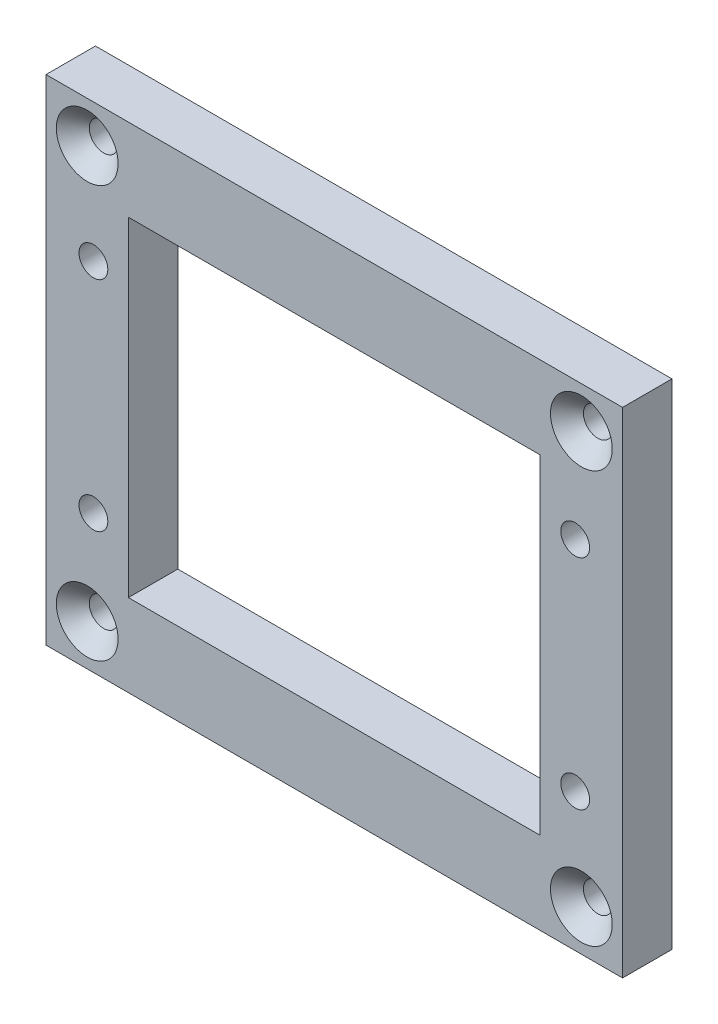
ISO-10303-21;
HEADER;
FILE_DESCRIPTION(('STEP AP214'),'2;1');
FILE_NAME('part.step','',(''),(''),'','','');
FILE_SCHEMA(('AUTOMOTIVE_DESIGN { 1 0 10303 214 1 1 1 1 }'));
ENDSEC;
DATA;
#1=APPLICATION_CONTEXT('core data for automotive mechanical design processes');
#2=APPLICATION_PROTOCOL_DEFINITION('international standard','automotive_design',2000,#1);
#3=PRODUCT_CONTEXT('',#1,'mechanical');
#4=PRODUCT('Part','Part','',(#3));
#5=PRODUCT_RELATED_PRODUCT_CATEGORY('part','',(#4));
#6=PRODUCT_DEFINITION_FORMATION('','',#4);
#7=PRODUCT_DEFINITION_CONTEXT('part definition',#1,'design');
#8=PRODUCT_DEFINITION('design','',#6,#7);
#9=PRODUCT_DEFINITION_SHAPE('','',#8);
#10=(LENGTH_UNIT() NAMED_UNIT(*) SI_UNIT(.MILLI.,.METRE.));
#11=(NAMED_UNIT(*) PLANE_ANGLE_UNIT() SI_UNIT($,.RADIAN.));
#12=(NAMED_UNIT(*) SI_UNIT($,.STERADIAN.) SOLID_ANGLE_UNIT());
#13=UNCERTAINTY_MEASURE_WITH_UNIT(LENGTH_MEASURE(1.E-05),#10,'distance_accuracy_value','');
#14=(GEOMETRIC_REPRESENTATION_CONTEXT(3) GLOBAL_UNCERTAINTY_ASSIGNED_CONTEXT((#13)) GLOBAL_UNIT_ASSIGNED_CONTEXT((#10,
#11,#12)) REPRESENTATION_CONTEXT('',''));
#15=CARTESIAN_POINT('',(0.,0.,0.));
#16=DIRECTION('',(0.,0.,1.));
#17=DIRECTION('',(1.,0.,0.));
#18=AXIS2_PLACEMENT_3D('',#15,#16,#17);
#19=CARTESIAN_POINT('',(5.75,16.75,6.));
#20=DIRECTION('',(0.,0.,-1.));
#21=DIRECTION('',(-1.,0.,0.));
#22=AXIS2_PLACEMENT_3D('',#19,#20,#21);
#23=CYLINDRICAL_SURFACE('',#22,1.75);
#24=CARTESIAN_POINT('',(5.75,16.75,6.));
#25=DIRECTION('',(0.,0.,1.));
#26=DIRECTION('',(1.,0.,0.));
#27=AXIS2_PLACEMENT_3D('',#24,#25,#26);
#28=CIRCLE('',#27,1.75);
#29=CARTESIAN_POINT('',(7.5,16.75,6.));
#30=VERTEX_POINT('',#29);
#31=EDGE_CURVE('E150',#30,#30,#28,.T.);
#32=ORIENTED_EDGE('',*,*,#31,.T.);
#33=EDGE_LOOP('',(#32));
#34=FACE_BOUND('',#33,.T.);
#35=CARTESIAN_POINT('',(5.75,16.75,3.));
#36=DIRECTION('',(0.,0.,-1.));
#37=DIRECTION('',(-1.,0.,0.));
#38=AXIS2_PLACEMENT_3D('',#35,#36,#37);
#39=CIRCLE('',#38,1.75);
#40=CARTESIAN_POINT('',(4.,16.75,3.));
#41=VERTEX_POINT('',#40);
#42=EDGE_CURVE('E37',#41,#41,#39,.T.);
#43=ORIENTED_EDGE('',*,*,#42,.T.);
#44=EDGE_LOOP('',(#43));
#45=FACE_BOUND('',#44,.T.);
#46=ADVANCED_FACE('F33',(#34,#45),#23,.F.);
#47=CARTESIAN_POINT('',(5.75,43.25,6.));
#48=DIRECTION('',(0.,0.,-1.));
#49=DIRECTION('',(-1.,0.,0.));
#50=AXIS2_PLACEMENT_3D('',#47,#48,#49);
#51=CYLINDRICAL_SURFACE('',#50,1.75);
#52=CARTESIAN_POINT('',(5.75,43.25,6.));
#53=DIRECTION('',(0.,0.,1.));
#54=DIRECTION('',(1.,0.,0.));
#55=AXIS2_PLACEMENT_3D('',#52,#53,#54);
#56=CIRCLE('',#55,1.75);
#57=CARTESIAN_POINT('',(7.5,43.25,6.));
#58=VERTEX_POINT('',#57);
#59=EDGE_CURVE('E147',#58,#58,#56,.T.);
#60=ORIENTED_EDGE('',*,*,#59,.T.);
#61=EDGE_LOOP('',(#60));
#62=FACE_BOUND('',#61,.T.);
#63=CARTESIAN_POINT('',(5.75,43.25,3.));
#64=DIRECTION('',(0.,0.,-1.));
#65=DIRECTION('',(-1.,0.,0.));
#66=AXIS2_PLACEMENT_3D('',#63,#64,#65);
#67=CIRCLE('',#66,1.75);
#68=CARTESIAN_POINT('',(4.,43.25,3.));
#69=VERTEX_POINT('',#68);
#70=EDGE_CURVE('E210',#69,#69,#67,.T.);
#71=ORIENTED_EDGE('',*,*,#70,.T.);
#72=EDGE_LOOP('',(#71));
#73=FACE_BOUND('',#72,.T.);
#74=ADVANCED_FACE('F253',(#62,#73),#51,.F.);
#75=CARTESIAN_POINT('',(64.25,16.75,6.));
#76=DIRECTION('',(0.,0.,-1.));
#77=DIRECTION('',(-1.,0.,0.));
#78=AXIS2_PLACEMENT_3D('',#75,#76,#77);
#79=CYLINDRICAL_SURFACE('',#78,1.75);
#80=CARTESIAN_POINT('',(64.25,16.75,6.));
#81=DIRECTION('',(0.,0.,1.));
#82=DIRECTION('',(1.,0.,0.));
#83=AXIS2_PLACEMENT_3D('',#80,#81,#82);
#84=CIRCLE('',#83,1.75);
#85=CARTESIAN_POINT('',(66.,16.75,6.));
#86=VERTEX_POINT('',#85);
#87=EDGE_CURVE('E141',#86,#86,#84,.T.);
#88=ORIENTED_EDGE('',*,*,#87,.T.);
#89=EDGE_LOOP('',(#88));
#90=FACE_BOUND('',#89,.T.);
#91=CARTESIAN_POINT('',(64.25,16.75,3.));
#92=DIRECTION('',(0.,0.,-1.));
#93=DIRECTION('',(-1.,0.,0.));
#94=AXIS2_PLACEMENT_3D('',#91,#92,#93);
#95=CIRCLE('',#94,1.75);
#96=CARTESIAN_POINT('',(62.5,16.75,3.));
#97=VERTEX_POINT('',#96);
#98=EDGE_CURVE('E208',#97,#97,#95,.T.);
#99=ORIENTED_EDGE('',*,*,#98,.T.);
#100=EDGE_LOOP('',(#99));
#101=FACE_BOUND('',#100,.T.);
#102=ADVANCED_FACE('F259',(#90,#101),#79,.F.);
#103=CARTESIAN_POINT('',(64.25,43.25,6.));
#104=DIRECTION('',(0.,0.,-1.));
#105=DIRECTION('',(-1.,0.,0.));
#106=AXIS2_PLACEMENT_3D('',#103,#104,#105);
#107=CYLINDRICAL_SURFACE('',#106,1.75);
#108=CARTESIAN_POINT('',(64.25,43.25,6.));
#109=DIRECTION('',(0.,0.,1.));
#110=DIRECTION('',(1.,0.,0.));
#111=AXIS2_PLACEMENT_3D('',#108,#109,#110);
#112=CIRCLE('',#111,1.75);
#113=CARTESIAN_POINT('',(66.,43.25,6.));
#114=VERTEX_POINT('',#113);
#115=EDGE_CURVE('E144',#114,#114,#112,.T.);
#116=ORIENTED_EDGE('',*,*,#115,.T.);
#117=EDGE_LOOP('',(#116));
#118=FACE_BOUND('',#117,.T.);
#119=CARTESIAN_POINT('',(64.25,43.25,3.));
#120=DIRECTION('',(0.,0.,-1.));
#121=DIRECTION('',(-1.,0.,0.));
#122=AXIS2_PLACEMENT_3D('',#119,#120,#121);
#123=CIRCLE('',#122,1.75);
#124=CARTESIAN_POINT('',(62.5,43.25,3.));
#125=VERTEX_POINT('',#124);
#126=EDGE_CURVE('E203',#125,#125,#123,.T.);
#127=ORIENTED_EDGE('',*,*,#126,.T.);
#128=EDGE_LOOP('',(#127));
#129=FACE_BOUND('',#128,.T.);
#130=ADVANCED_FACE('F266',(#118,#129),#107,.F.);
#131=CARTESIAN_POINT('',(0.,0.,6.));
#132=DIRECTION('',(0.,0.,-1.));
#133=DIRECTION('',(-1.,0.,0.));
#134=AXIS2_PLACEMENT_3D('',#131,#132,#133);
#135=PLANE('',#134);
#136=CARTESIAN_POINT('',(5.00000000000123,5.,6.));
#137=DIRECTION('',(0.,0.,-1.));
#138=DIRECTION('',(-1.,0.,0.));
#139=AXIS2_PLACEMENT_3D('',#136,#137,#138);
#140=CIRCLE('',#139,3.75000000000002);
#141=CARTESIAN_POINT('',(1.25000000000122,5.,6.));
#142=VERTEX_POINT('',#141);
#143=EDGE_CURVE('E195',#142,#142,#140,.T.);
#144=ORIENTED_EDGE('',*,*,#143,.T.);
#145=EDGE_LOOP('',(#144));
#146=FACE_BOUND('',#145,.T.);
#147=CARTESIAN_POINT('',(65.0000000000012,5.,6.));
#148=DIRECTION('',(0.,0.,-1.));
#149=DIRECTION('',(-1.,0.,0.));
#150=AXIS2_PLACEMENT_3D('',#147,#148,#149);
#151=CIRCLE('',#150,3.75000000000002);
#152=CARTESIAN_POINT('',(61.2500000000012,5.,6.));
#153=VERTEX_POINT('',#152);
#154=EDGE_CURVE('E192',#153,#153,#151,.T.);
#155=ORIENTED_EDGE('',*,*,#154,.T.);
#156=EDGE_LOOP('',(#155));
#157=FACE_BOUND('',#156,.T.);
#158=CARTESIAN_POINT('',(65.,55.,6.));
#159=DIRECTION('',(0.,0.,-1.));
#160=DIRECTION('',(-1.,0.,0.));
#161=AXIS2_PLACEMENT_3D('',#158,#159,#160);
#162=CIRCLE('',#161,3.75000000000002);
#163=CARTESIAN_POINT('',(61.25,55.,6.));
#164=VERTEX_POINT('',#163);
#165=EDGE_CURVE('E189',#164,#164,#162,.T.);
#166=ORIENTED_EDGE('',*,*,#165,.T.);
#167=EDGE_LOOP('',(#166));
#168=FACE_BOUND('',#167,.T.);
#169=CARTESIAN_POINT('',(5.,55.,6.));
#170=DIRECTION('',(0.,0.,-1.));
#171=DIRECTION('',(-1.,0.,0.));
#172=AXIS2_PLACEMENT_3D('',#169,#170,#171);
#173=CIRCLE('',#172,3.75000000000002);
#174=CARTESIAN_POINT('',(1.24999999999998,55.,6.));
#175=VERTEX_POINT('',#174);
#176=EDGE_CURVE('E186',#175,#175,#173,.T.);
#177=ORIENTED_EDGE('',*,*,#176,.T.);
#178=EDGE_LOOP('',(#177));
#179=FACE_BOUND('',#178,.T.);
#180=ORIENTED_EDGE('',*,*,#87,.F.);
#181=EDGE_LOOP('',(#180));
#182=FACE_BOUND('',#181,.T.);
#183=ORIENTED_EDGE('',*,*,#115,.F.);
#184=EDGE_LOOP('',(#183));
#185=FACE_BOUND('',#184,.T.);
#186=ORIENTED_EDGE('',*,*,#59,.F.);
#187=EDGE_LOOP('',(#186));
#188=FACE_BOUND('',#187,.T.);
#189=ORIENTED_EDGE('',*,*,#31,.F.);
#190=EDGE_LOOP('',(#189));
#191=FACE_BOUND('',#190,.T.);
#192=DIRECTION('',(0.,-1.,0.));
#193=VECTOR('',#192,1.);
#194=CARTESIAN_POINT('',(0.,0.,6.));
#195=LINE('',#194,#193);
#196=CARTESIAN_POINT('',(0.,60.,6.));
#197=VERTEX_POINT('',#196);
#198=CARTESIAN_POINT('',(0.,0.,6.));
#199=VERTEX_POINT('',#198);
#200=EDGE_CURVE('E154',#197,#199,#195,.T.);
#201=ORIENTED_EDGE('',*,*,#200,.T.);
#202=DIRECTION('',(1.,0.,0.));
#203=VECTOR('',#202,1.);
#204=CARTESIAN_POINT('',(0.,0.,6.));
#205=LINE('',#204,#203);
#206=CARTESIAN_POINT('',(70.,0.,6.));
#207=VERTEX_POINT('',#206);
#208=EDGE_CURVE('E157',#199,#207,#205,.T.);
#209=ORIENTED_EDGE('',*,*,#208,.T.);
#210=DIRECTION('',(0.,1.,0.));
#211=VECTOR('',#210,1.);
#212=CARTESIAN_POINT('',(70.,0.,6.));
#213=LINE('',#212,#211);
#214=CARTESIAN_POINT('',(70.,60.,6.));
#215=VERTEX_POINT('',#214);
#216=EDGE_CURVE('E160',#207,#215,#213,.T.);
#217=ORIENTED_EDGE('',*,*,#216,.T.);
#218=DIRECTION('',(-1.,0.,0.));
#219=VECTOR('',#218,1.);
#220=CARTESIAN_POINT('',(0.,60.,6.));
#221=LINE('',#220,#219);
#222=EDGE_CURVE('E162',#215,#197,#221,.T.);
#223=ORIENTED_EDGE('',*,*,#222,.T.);
#224=EDGE_LOOP('',(#201,#209,#217,#223));
#225=FACE_BOUND('',#224,.T.);
#226=DIRECTION('',(0.,-1.,0.));
#227=VECTOR('',#226,1.);
#228=CARTESIAN_POINT('',(10.,50.,6.));
#229=LINE('',#228,#227);
#230=CARTESIAN_POINT('',(10.,50.,6.));
#231=VERTEX_POINT('',#230);
#232=CARTESIAN_POINT('',(10.,10.,6.));
#233=VERTEX_POINT('',#232);
#234=EDGE_CURVE('E100',#231,#233,#229,.T.);
#235=ORIENTED_EDGE('',*,*,#234,.F.);
#236=DIRECTION('',(-1.,0.,0.));
#237=VECTOR('',#236,1.);
#238=CARTESIAN_POINT('',(10.,50.,6.));
#239=LINE('',#238,#237);
#240=CARTESIAN_POINT('',(60.,50.,6.));
#241=VERTEX_POINT('',#240);
#242=EDGE_CURVE('E123',#241,#231,#239,.T.);
#243=ORIENTED_EDGE('',*,*,#242,.F.);
#244=DIRECTION('',(0.,1.,0.));
#245=VECTOR('',#244,1.);
#246=CARTESIAN_POINT('',(60.,50.,6.));
#247=LINE('',#246,#245);
#248=CARTESIAN_POINT('',(60.,10.,6.));
#249=VERTEX_POINT('',#248);
#250=EDGE_CURVE('E121',#249,#241,#247,.T.);
#251=ORIENTED_EDGE('',*,*,#250,.F.);
#252=DIRECTION('',(1.,0.,0.));
#253=VECTOR('',#252,1.);
#254=CARTESIAN_POINT('',(10.,10.,6.));
#255=LINE('',#254,#253);
#256=EDGE_CURVE('E108',#233,#249,#255,.T.);
#257=ORIENTED_EDGE('',*,*,#256,.F.);
#258=EDGE_LOOP('',(#235,#243,#251,#257));
#259=FACE_BOUND('',#258,.T.);
#260=ADVANCED_FACE('F120',(#146,#157,#168,#179,#182,#185,#188,#191,#225,#259),#135,.F.);
#261=CARTESIAN_POINT('',(0.,0.,0.));
#262=DIRECTION('',(0.,0.,-1.));
#263=DIRECTION('',(-1.,0.,0.));
#264=AXIS2_PLACEMENT_3D('',#261,#262,#263);
#265=PLANE('',#264);
#266=CARTESIAN_POINT('',(64.25,16.75,0.));
#267=DIRECTION('',(0.,0.,-1.));
#268=DIRECTION('',(-1.,0.,0.));
#269=AXIS2_PLACEMENT_3D('',#266,#267,#268);
#270=CIRCLE('',#269,3.);
#271=CARTESIAN_POINT('',(61.25,16.75,0.));
#272=VERTEX_POINT('',#271);
#273=EDGE_CURVE('E484',#272,#272,#270,.T.);
#274=ORIENTED_EDGE('',*,*,#273,.F.);
#275=EDGE_LOOP('',(#274));
#276=FACE_BOUND('',#275,.T.);
#277=CARTESIAN_POINT('',(5.75,16.75,0.));
#278=DIRECTION('',(0.,0.,-1.));
#279=DIRECTION('',(-1.,0.,0.));
#280=AXIS2_PLACEMENT_3D('',#277,#278,#279);
#281=CIRCLE('',#280,3.);
#282=CARTESIAN_POINT('',(2.75,16.75,0.));
#283=VERTEX_POINT('',#282);
#284=EDGE_CURVE('E485',#283,#283,#281,.T.);
#285=ORIENTED_EDGE('',*,*,#284,.F.);
#286=EDGE_LOOP('',(#285));
#287=FACE_BOUND('',#286,.T.);
#288=CARTESIAN_POINT('',(5.75,43.25,0.));
#289=DIRECTION('',(0.,0.,-1.));
#290=DIRECTION('',(-1.,0.,0.));
#291=AXIS2_PLACEMENT_3D('',#288,#289,#290);
#292=CIRCLE('',#291,3.);
#293=CARTESIAN_POINT('',(2.75,43.25,0.));
#294=VERTEX_POINT('',#293);
#295=EDGE_CURVE('E495',#294,#294,#292,.T.);
#296=ORIENTED_EDGE('',*,*,#295,.F.);
#297=EDGE_LOOP('',(#296));
#298=FACE_BOUND('',#297,.T.);
#299=CARTESIAN_POINT('',(64.25,43.25,0.));
#300=DIRECTION('',(0.,0.,-1.));
#301=DIRECTION('',(-1.,0.,0.));
#302=AXIS2_PLACEMENT_3D('',#299,#300,#301);
#303=CIRCLE('',#302,3.);
#304=CARTESIAN_POINT('',(61.25,43.25,0.));
#305=VERTEX_POINT('',#304);
#306=EDGE_CURVE('E216',#305,#305,#303,.T.);
#307=ORIENTED_EDGE('',*,*,#306,.F.);
#308=EDGE_LOOP('',(#307));
#309=FACE_BOUND('',#308,.T.);
#310=CARTESIAN_POINT('',(65.0000000000012,5.,0.));
#311=DIRECTION('',(0.,0.,1.));
#312=DIRECTION('',(1.,0.,0.));
#313=AXIS2_PLACEMENT_3D('',#310,#311,#312);
#314=CIRCLE('',#313,1.75);
#315=CARTESIAN_POINT('',(66.7500000000012,5.,0.));
#316=VERTEX_POINT('',#315);
#317=EDGE_CURVE('E229',#316,#316,#314,.T.);
#318=ORIENTED_EDGE('',*,*,#317,.T.);
#319=EDGE_LOOP('',(#318));
#320=FACE_BOUND('',#319,.T.);
#321=DIRECTION('',(-1.,0.,0.));
#322=VECTOR('',#321,1.);
#323=CARTESIAN_POINT('',(10.,50.,0.));
#324=LINE('',#323,#322);
#325=CARTESIAN_POINT('',(60.,50.,0.));
#326=VERTEX_POINT('',#325);
#327=CARTESIAN_POINT('',(10.,50.,0.));
#328=VERTEX_POINT('',#327);
#329=EDGE_CURVE('E109',#326,#328,#324,.T.);
#330=ORIENTED_EDGE('',*,*,#329,.T.);
#331=DIRECTION('',(0.,-1.,0.));
#332=VECTOR('',#331,1.);
#333=CARTESIAN_POINT('',(10.,50.,0.));
#334=LINE('',#333,#332);
#335=CARTESIAN_POINT('',(10.,10.,0.));
#336=VERTEX_POINT('',#335);
#337=EDGE_CURVE('E58',#328,#336,#334,.T.);
#338=ORIENTED_EDGE('',*,*,#337,.T.);
#339=DIRECTION('',(1.,0.,0.));
#340=VECTOR('',#339,1.);
#341=CARTESIAN_POINT('',(10.,10.,0.));
#342=LINE('',#341,#340);
#343=CARTESIAN_POINT('',(60.,10.,0.));
#344=VERTEX_POINT('',#343);
#345=EDGE_CURVE('E115',#336,#344,#342,.T.);
#346=ORIENTED_EDGE('',*,*,#345,.T.);
#347=DIRECTION('',(0.,1.,0.));
#348=VECTOR('',#347,1.);
#349=CARTESIAN_POINT('',(60.,50.,0.));
#350=LINE('',#349,#348);
#351=EDGE_CURVE('E131',#344,#326,#350,.T.);
#352=ORIENTED_EDGE('',*,*,#351,.T.);
#353=EDGE_LOOP('',(#330,#338,#346,#352));
#354=FACE_BOUND('',#353,.T.);
#355=CARTESIAN_POINT('',(5.,55.,0.));
#356=DIRECTION('',(0.,0.,1.));
#357=DIRECTION('',(1.,0.,0.));
#358=AXIS2_PLACEMENT_3D('',#355,#356,#357);
#359=CIRCLE('',#358,1.75);
#360=CARTESIAN_POINT('',(6.75,55.,0.));
#361=VERTEX_POINT('',#360);
#362=EDGE_CURVE('E116',#361,#361,#359,.T.);
#363=ORIENTED_EDGE('',*,*,#362,.T.);
#364=EDGE_LOOP('',(#363));
#365=FACE_BOUND('',#364,.T.);
#366=DIRECTION('',(0.,-1.,0.));
#367=VECTOR('',#366,1.);
#368=CARTESIAN_POINT('',(0.,0.,0.));
#369=LINE('',#368,#367);
#370=CARTESIAN_POINT('',(0.,60.,0.));
#371=VERTEX_POINT('',#370);
#372=CARTESIAN_POINT('',(0.,0.,0.));
#373=VERTEX_POINT('',#372);
#374=EDGE_CURVE('E153',#371,#373,#369,.T.);
#375=ORIENTED_EDGE('',*,*,#374,.F.);
#376=DIRECTION('',(-1.,0.,0.));
#377=VECTOR('',#376,1.);
#378=CARTESIAN_POINT('',(0.,60.,0.));
#379=LINE('',#378,#377);
#380=CARTESIAN_POINT('',(70.,60.,0.));
#381=VERTEX_POINT('',#380);
#382=EDGE_CURVE('E158',#381,#371,#379,.T.);
#383=ORIENTED_EDGE('',*,*,#382,.F.);
#384=DIRECTION('',(0.,1.,0.));
#385=VECTOR('',#384,1.);
#386=CARTESIAN_POINT('',(70.,0.,0.));
#387=LINE('',#386,#385);
#388=CARTESIAN_POINT('',(70.,0.,0.));
#389=VERTEX_POINT('',#388);
#390=EDGE_CURVE('E169',#389,#381,#387,.T.);
#391=ORIENTED_EDGE('',*,*,#390,.F.);
#392=DIRECTION('',(1.,0.,0.));
#393=VECTOR('',#392,1.);
#394=CARTESIAN_POINT('',(0.,0.,0.));
#395=LINE('',#394,#393);
#396=EDGE_CURVE('E167',#373,#389,#395,.T.);
#397=ORIENTED_EDGE('',*,*,#396,.F.);
#398=EDGE_LOOP('',(#375,#383,#391,#397));
#399=FACE_BOUND('',#398,.T.);
#400=CARTESIAN_POINT('',(65.,55.,0.));
#401=DIRECTION('',(0.,0.,1.));
#402=DIRECTION('',(1.,0.,0.));
#403=AXIS2_PLACEMENT_3D('',#400,#401,#402);
#404=CIRCLE('',#403,1.75);
#405=CARTESIAN_POINT('',(66.75,55.,0.));
#406=VERTEX_POINT('',#405);
#407=EDGE_CURVE('E129',#406,#406,#404,.T.);
#408=ORIENTED_EDGE('',*,*,#407,.T.);
#409=EDGE_LOOP('',(#408));
#410=FACE_BOUND('',#409,.T.);
#411=CARTESIAN_POINT('',(5.00000000000123,5.,0.));
#412=DIRECTION('',(0.,0.,1.));
#413=DIRECTION('',(1.,0.,0.));
#414=AXIS2_PLACEMENT_3D('',#411,#412,#413);
#415=CIRCLE('',#414,1.75);
#416=CARTESIAN_POINT('',(6.75000000000124,5.,0.));
#417=VERTEX_POINT('',#416);
#418=EDGE_CURVE('E206',#417,#417,#415,.T.);
#419=ORIENTED_EDGE('',*,*,#418,.T.);
#420=EDGE_LOOP('',(#419));
#421=FACE_BOUND('',#420,.T.);
#422=ADVANCED_FACE('F234',(#276,#287,#298,#309,#320,#354,#365,#399,#410,#421),#265,.T.);
#423=CARTESIAN_POINT('',(0.,0.,6.));
#424=DIRECTION('',(1.,0.,0.));
#425=DIRECTION('',(0.,0.,-1.));
#426=AXIS2_PLACEMENT_3D('',#423,#424,#425);
#427=PLANE('',#426);
#428=ORIENTED_EDGE('',*,*,#374,.T.);
#429=DIRECTION('',(0.,0.,-1.));
#430=VECTOR('',#429,1.);
#431=CARTESIAN_POINT('',(0.,0.,6.));
#432=LINE('',#431,#430);
#433=EDGE_CURVE('E180',#199,#373,#432,.T.);
#434=ORIENTED_EDGE('',*,*,#433,.F.);
#435=ORIENTED_EDGE('',*,*,#200,.F.);
#436=DIRECTION('',(0.,0.,-1.));
#437=VECTOR('',#436,1.);
#438=CARTESIAN_POINT('',(0.,60.,6.));
#439=LINE('',#438,#437);
#440=EDGE_CURVE('E164',#197,#371,#439,.T.);
#441=ORIENTED_EDGE('',*,*,#440,.T.);
#442=EDGE_LOOP('',(#428,#434,#435,#441));
#443=FACE_BOUND('',#442,.T.);
#444=ADVANCED_FACE('F270',(#443),#427,.F.);
#445=CARTESIAN_POINT('',(0.,0.,6.));
#446=DIRECTION('',(0.,1.,0.));
#447=DIRECTION('',(0.,0.,1.));
#448=AXIS2_PLACEMENT_3D('',#445,#446,#447);
#449=PLANE('',#448);
#450=ORIENTED_EDGE('',*,*,#396,.T.);
#451=DIRECTION('',(0.,0.,-1.));
#452=VECTOR('',#451,1.);
#453=CARTESIAN_POINT('',(70.,0.,6.));
#454=LINE('',#453,#452);
#455=EDGE_CURVE('E177',#207,#389,#454,.T.);
#456=ORIENTED_EDGE('',*,*,#455,.F.);
#457=ORIENTED_EDGE('',*,*,#208,.F.);
#458=ORIENTED_EDGE('',*,*,#433,.T.);
#459=EDGE_LOOP('',(#450,#456,#457,#458));
#460=FACE_BOUND('',#459,.T.);
#461=ADVANCED_FACE('F280',(#460),#449,.F.);
#462=CARTESIAN_POINT('',(70.,0.,6.));
#463=DIRECTION('',(-1.,0.,0.));
#464=DIRECTION('',(0.,0.,1.));
#465=AXIS2_PLACEMENT_3D('',#462,#463,#464);
#466=PLANE('',#465);
#467=ORIENTED_EDGE('',*,*,#390,.T.);
#468=DIRECTION('',(0.,0.,-1.));
#469=VECTOR('',#468,1.);
#470=CARTESIAN_POINT('',(70.,60.,6.));
#471=LINE('',#470,#469);
#472=EDGE_CURVE('E174',#215,#381,#471,.T.);
#473=ORIENTED_EDGE('',*,*,#472,.F.);
#474=ORIENTED_EDGE('',*,*,#216,.F.);
#475=ORIENTED_EDGE('',*,*,#455,.T.);
#476=EDGE_LOOP('',(#467,#473,#474,#475));
#477=FACE_BOUND('',#476,.T.);
#478=ADVANCED_FACE('F276',(#477),#466,.F.);
#479=CARTESIAN_POINT('',(0.,60.,6.));
#480=DIRECTION('',(0.,-1.,0.));
#481=DIRECTION('',(0.,0.,-1.));
#482=AXIS2_PLACEMENT_3D('',#479,#480,#481);
#483=PLANE('',#482);
#484=ORIENTED_EDGE('',*,*,#382,.T.);
#485=ORIENTED_EDGE('',*,*,#440,.F.);
#486=ORIENTED_EDGE('',*,*,#222,.F.);
#487=ORIENTED_EDGE('',*,*,#472,.T.);
#488=EDGE_LOOP('',(#484,#485,#486,#487));
#489=FACE_BOUND('',#488,.T.);
#490=ADVANCED_FACE('F272',(#489),#483,.F.);
#491=CARTESIAN_POINT('',(5.,55.,6.));
#492=DIRECTION('',(0.,0.,-1.));
#493=DIRECTION('',(-1.,0.,0.));
#494=AXIS2_PLACEMENT_3D('',#491,#492,#493);
#495=CYLINDRICAL_SURFACE('',#494,1.75);
#496=CARTESIAN_POINT('',(5.,55.,3.99999999999999));
#497=DIRECTION('',(0.,0.,-1.));
#498=DIRECTION('',(-1.,0.,0.));
#499=AXIS2_PLACEMENT_3D('',#496,#497,#498);
#500=CIRCLE('',#499,1.75);
#501=CARTESIAN_POINT('',(3.25,55.,3.99999999999999));
#502=VERTEX_POINT('',#501);
#503=EDGE_CURVE('E11',#502,#502,#500,.F.);
#504=ORIENTED_EDGE('',*,*,#503,.T.);
#505=EDGE_LOOP('',(#504));
#506=FACE_BOUND('',#505,.T.);
#507=ORIENTED_EDGE('',*,*,#362,.F.);
#508=EDGE_LOOP('',(#507));
#509=FACE_BOUND('',#508,.T.);
#510=ADVANCED_FACE('F275',(#506,#509),#495,.F.);
#511=CARTESIAN_POINT('',(10.,50.,6.));
#512=DIRECTION('',(1.,0.,0.));
#513=DIRECTION('',(0.,1.,0.));
#514=AXIS2_PLACEMENT_3D('',#511,#512,#513);
#515=PLANE('',#514);
#516=ORIENTED_EDGE('',*,*,#337,.F.);
#517=DIRECTION('',(0.,0.,-1.));
#518=VECTOR('',#517,1.);
#519=CARTESIAN_POINT('',(10.,50.,6.));
#520=LINE('',#519,#518);
#521=EDGE_CURVE('E104',#231,#328,#520,.T.);
#522=ORIENTED_EDGE('',*,*,#521,.F.);
#523=ORIENTED_EDGE('',*,*,#234,.T.);
#524=DIRECTION('',(0.,0.,-1.));
#525=VECTOR('',#524,1.);
#526=CARTESIAN_POINT('',(10.,10.,6.));
#527=LINE('',#526,#525);
#528=EDGE_CURVE('E103',#233,#336,#527,.T.);
#529=ORIENTED_EDGE('',*,*,#528,.T.);
#530=EDGE_LOOP('',(#516,#522,#523,#529));
#531=FACE_BOUND('',#530,.T.);
#532=ADVANCED_FACE('F102',(#531),#515,.T.);
#533=CARTESIAN_POINT('',(10.,10.,6.));
#534=DIRECTION('',(0.,1.,0.));
#535=DIRECTION('',(0.,0.,1.));
#536=AXIS2_PLACEMENT_3D('',#533,#534,#535);
#537=PLANE('',#536);
#538=ORIENTED_EDGE('',*,*,#345,.F.);
#539=ORIENTED_EDGE('',*,*,#528,.F.);
#540=ORIENTED_EDGE('',*,*,#256,.T.);
#541=DIRECTION('',(0.,0.,-1.));
#542=VECTOR('',#541,1.);
#543=CARTESIAN_POINT('',(60.,10.,6.));
#544=LINE('',#543,#542);
#545=EDGE_CURVE('E117',#249,#344,#544,.T.);
#546=ORIENTED_EDGE('',*,*,#545,.T.);
#547=EDGE_LOOP('',(#538,#539,#540,#546));
#548=FACE_BOUND('',#547,.T.);
#549=ADVANCED_FACE('F112',(#548),#537,.T.);
#550=CARTESIAN_POINT('',(60.,50.,6.));
#551=DIRECTION('',(-1.,0.,0.));
#552=DIRECTION('',(0.,-1.,0.));
#553=AXIS2_PLACEMENT_3D('',#550,#551,#552);
#554=PLANE('',#553);
#555=ORIENTED_EDGE('',*,*,#351,.F.);
#556=ORIENTED_EDGE('',*,*,#545,.F.);
#557=ORIENTED_EDGE('',*,*,#250,.T.);
#558=DIRECTION('',(0.,0.,-1.));
#559=VECTOR('',#558,1.);
#560=CARTESIAN_POINT('',(60.,50.,6.));
#561=LINE('',#560,#559);
#562=EDGE_CURVE('E50',#241,#326,#561,.T.);
#563=ORIENTED_EDGE('',*,*,#562,.T.);
#564=EDGE_LOOP('',(#555,#556,#557,#563));
#565=FACE_BOUND('',#564,.T.);
#566=ADVANCED_FACE('F250',(#565),#554,.T.);
#567=CARTESIAN_POINT('',(10.,50.,6.));
#568=DIRECTION('',(0.,-1.,0.));
#569=DIRECTION('',(0.,0.,-1.));
#570=AXIS2_PLACEMENT_3D('',#567,#568,#569);
#571=PLANE('',#570);
#572=ORIENTED_EDGE('',*,*,#329,.F.);
#573=ORIENTED_EDGE('',*,*,#562,.F.);
#574=ORIENTED_EDGE('',*,*,#242,.T.);
#575=ORIENTED_EDGE('',*,*,#521,.T.);
#576=EDGE_LOOP('',(#572,#573,#574,#575));
#577=FACE_BOUND('',#576,.T.);
#578=ADVANCED_FACE('F240',(#577),#571,.T.);
#579=CARTESIAN_POINT('',(65.,55.,6.));
#580=DIRECTION('',(0.,0.,-1.));
#581=DIRECTION('',(-1.,0.,0.));
#582=AXIS2_PLACEMENT_3D('',#579,#580,#581);
#583=CYLINDRICAL_SURFACE('',#582,1.75);
#584=CARTESIAN_POINT('',(65.,55.,3.99999999999997));
#585=DIRECTION('',(0.,0.,-1.));
#586=DIRECTION('',(-1.,0.,0.));
#587=AXIS2_PLACEMENT_3D('',#584,#585,#586);
#588=CIRCLE('',#587,1.75);
#589=CARTESIAN_POINT('',(63.25,55.,3.99999999999997));
#590=VERTEX_POINT('',#589);
#591=EDGE_CURVE('E42',#590,#590,#588,.F.);
#592=ORIENTED_EDGE('',*,*,#591,.T.);
#593=EDGE_LOOP('',(#592));
#594=FACE_BOUND('',#593,.T.);
#595=ORIENTED_EDGE('',*,*,#407,.F.);
#596=EDGE_LOOP('',(#595));
#597=FACE_BOUND('',#596,.T.);
#598=ADVANCED_FACE('F237',(#594,#597),#583,.F.);
#599=CARTESIAN_POINT('',(65.0000000000012,5.,6.));
#600=DIRECTION('',(0.,0.,-1.));
#601=DIRECTION('',(-1.,0.,0.));
#602=AXIS2_PLACEMENT_3D('',#599,#600,#601);
#603=CYLINDRICAL_SURFACE('',#602,1.75);
#604=CARTESIAN_POINT('',(65.0000000000012,5.,3.99999999999997));
#605=DIRECTION('',(0.,0.,-1.));
#606=DIRECTION('',(-1.,0.,0.));
#607=AXIS2_PLACEMENT_3D('',#604,#605,#606);
#608=CIRCLE('',#607,1.75);
#609=CARTESIAN_POINT('',(63.2500000000012,5.,3.99999999999997));
#610=VERTEX_POINT('',#609);
#611=EDGE_CURVE('E198',#610,#610,#608,.F.);
#612=ORIENTED_EDGE('',*,*,#611,.T.);
#613=EDGE_LOOP('',(#612));
#614=FACE_BOUND('',#613,.T.);
#615=ORIENTED_EDGE('',*,*,#317,.F.);
#616=EDGE_LOOP('',(#615));
#617=FACE_BOUND('',#616,.T.);
#618=ADVANCED_FACE('F239',(#614,#617),#603,.F.);
#619=CARTESIAN_POINT('',(5.00000000000123,5.,6.));
#620=DIRECTION('',(0.,0.,-1.));
#621=DIRECTION('',(-1.,0.,0.));
#622=AXIS2_PLACEMENT_3D('',#619,#620,#621);
#623=CYLINDRICAL_SURFACE('',#622,1.75);
#624=CARTESIAN_POINT('',(5.00000000000123,5.,3.99999999999999));
#625=DIRECTION('',(0.,0.,-1.));
#626=DIRECTION('',(-1.,0.,0.));
#627=AXIS2_PLACEMENT_3D('',#624,#625,#626);
#628=CIRCLE('',#627,1.75);
#629=CARTESIAN_POINT('',(3.25000000000123,5.,3.99999999999999));
#630=VERTEX_POINT('',#629);
#631=EDGE_CURVE('E183',#630,#630,#628,.F.);
#632=ORIENTED_EDGE('',*,*,#631,.T.);
#633=EDGE_LOOP('',(#632));
#634=FACE_BOUND('',#633,.T.);
#635=ORIENTED_EDGE('',*,*,#418,.F.);
#636=EDGE_LOOP('',(#635));
#637=FACE_BOUND('',#636,.T.);
#638=ADVANCED_FACE('F247',(#634,#637),#623,.F.);
#639=CARTESIAN_POINT('',(5.00000000000123,5.,3.99999999999999));
#640=DIRECTION('',(0.,0.,1.));
#641=DIRECTION('',(1.,0.,0.));
#642=AXIS2_PLACEMENT_3D('',#639,#640,#641);
#643=CONICAL_SURFACE('',#642,1.75,0.78539816339745);
#644=ORIENTED_EDGE('',*,*,#143,.F.);
#645=EDGE_LOOP('',(#644));
#646=FACE_BOUND('',#645,.T.);
#647=ORIENTED_EDGE('',*,*,#631,.F.);
#648=EDGE_LOOP('',(#647));
#649=FACE_BOUND('',#648,.T.);
#650=ADVANCED_FACE('F288',(#646,#649),#643,.F.);
#651=CARTESIAN_POINT('',(65.0000000000012,5.,3.99999999999997));
#652=DIRECTION('',(0.,0.,1.));
#653=DIRECTION('',(1.,0.,0.));
#654=AXIS2_PLACEMENT_3D('',#651,#652,#653);
#655=CONICAL_SURFACE('',#654,1.75,0.785398163397449);
#656=ORIENTED_EDGE('',*,*,#154,.F.);
#657=EDGE_LOOP('',(#656));
#658=FACE_BOUND('',#657,.T.);
#659=ORIENTED_EDGE('',*,*,#611,.F.);
#660=EDGE_LOOP('',(#659));
#661=FACE_BOUND('',#660,.T.);
#662=ADVANCED_FACE('F291',(#658,#661),#655,.F.);
#663=CARTESIAN_POINT('',(65.,55.,3.99999999999997));
#664=DIRECTION('',(0.,0.,1.));
#665=DIRECTION('',(1.,0.,0.));
#666=AXIS2_PLACEMENT_3D('',#663,#664,#665);
#667=CONICAL_SURFACE('',#666,1.75,0.785398163397449);
#668=ORIENTED_EDGE('',*,*,#165,.F.);
#669=EDGE_LOOP('',(#668));
#670=FACE_BOUND('',#669,.T.);
#671=ORIENTED_EDGE('',*,*,#591,.F.);
#672=EDGE_LOOP('',(#671));
#673=FACE_BOUND('',#672,.T.);
#674=ADVANCED_FACE('F294',(#670,#673),#667,.F.);
#675=CARTESIAN_POINT('',(5.,55.,3.99999999999999));
#676=DIRECTION('',(0.,0.,1.));
#677=DIRECTION('',(1.,0.,0.));
#678=AXIS2_PLACEMENT_3D('',#675,#676,#677);
#679=CONICAL_SURFACE('',#678,1.75,0.78539816339745);
#680=ORIENTED_EDGE('',*,*,#176,.F.);
#681=EDGE_LOOP('',(#680));
#682=FACE_BOUND('',#681,.T.);
#683=ORIENTED_EDGE('',*,*,#503,.F.);
#684=EDGE_LOOP('',(#683));
#685=FACE_BOUND('',#684,.T.);
#686=ADVANCED_FACE('F35',(#682,#685),#679,.F.);
#687=CARTESIAN_POINT('',(64.25,43.25,3.));
#688=DIRECTION('',(0.,0.,-1.));
#689=DIRECTION('',(-1.,0.,0.));
#690=AXIS2_PLACEMENT_3D('',#687,#688,#689);
#691=CYLINDRICAL_SURFACE('',#690,3.);
#692=CARTESIAN_POINT('',(64.25,43.25,3.));
#693=DIRECTION('',(0.,0.,-1.));
#694=DIRECTION('',(-1.,0.,0.));
#695=AXIS2_PLACEMENT_3D('',#692,#693,#694);
#696=CIRCLE('',#695,3.);
#697=CARTESIAN_POINT('',(61.25,43.25,3.));
#698=VERTEX_POINT('',#697);
#699=EDGE_CURVE('E207',#698,#698,#696,.T.);
#700=ORIENTED_EDGE('',*,*,#699,.F.);
#701=EDGE_LOOP('',(#700));
#702=FACE_BOUND('',#701,.T.);
#703=ORIENTED_EDGE('',*,*,#306,.T.);
#704=EDGE_LOOP('',(#703));
#705=FACE_BOUND('',#704,.T.);
#706=ADVANCED_FACE('F301',(#702,#705),#691,.F.);
#707=CARTESIAN_POINT('',(64.25,43.25,3.));
#708=DIRECTION('',(0.,0.,-1.));
#709=DIRECTION('',(-1.,0.,0.));
#710=AXIS2_PLACEMENT_3D('',#707,#708,#709);
#711=PLANE('',#710);
#712=ORIENTED_EDGE('',*,*,#126,.F.);
#713=EDGE_LOOP('',(#712));
#714=FACE_BOUND('',#713,.T.);
#715=ORIENTED_EDGE('',*,*,#699,.T.);
#716=EDGE_LOOP('',(#715));
#717=FACE_BOUND('',#716,.T.);
#718=ADVANCED_FACE('F334',(#714,#717),#711,.T.);
#719=CARTESIAN_POINT('',(64.25,16.75,3.));
#720=DIRECTION('',(0.,0.,-1.));
#721=DIRECTION('',(-1.,0.,0.));
#722=AXIS2_PLACEMENT_3D('',#719,#720,#721);
#723=CYLINDRICAL_SURFACE('',#722,3.);
#724=CARTESIAN_POINT('',(64.25,16.75,3.));
#725=DIRECTION('',(0.,0.,-1.));
#726=DIRECTION('',(-1.,0.,0.));
#727=AXIS2_PLACEMENT_3D('',#724,#725,#726);
#728=CIRCLE('',#727,3.);
#729=CARTESIAN_POINT('',(61.25,16.75,3.));
#730=VERTEX_POINT('',#729);
#731=EDGE_CURVE('E211',#730,#730,#728,.T.);
#732=ORIENTED_EDGE('',*,*,#731,.F.);
#733=EDGE_LOOP('',(#732));
#734=FACE_BOUND('',#733,.T.);
#735=ORIENTED_EDGE('',*,*,#273,.T.);
#736=EDGE_LOOP('',(#735));
#737=FACE_BOUND('',#736,.T.);
#738=ADVANCED_FACE('F337',(#734,#737),#723,.F.);
#739=CARTESIAN_POINT('',(64.25,16.75,3.));
#740=DIRECTION('',(0.,0.,-1.));
#741=DIRECTION('',(-1.,0.,0.));
#742=AXIS2_PLACEMENT_3D('',#739,#740,#741);
#743=PLANE('',#742);
#744=ORIENTED_EDGE('',*,*,#98,.F.);
#745=EDGE_LOOP('',(#744));
#746=FACE_BOUND('',#745,.T.);
#747=ORIENTED_EDGE('',*,*,#731,.T.);
#748=EDGE_LOOP('',(#747));
#749=FACE_BOUND('',#748,.T.);
#750=ADVANCED_FACE('F427',(#746,#749),#743,.T.);
#751=CARTESIAN_POINT('',(5.75,43.25,3.));
#752=DIRECTION('',(0.,0.,-1.));
#753=DIRECTION('',(-1.,0.,0.));
#754=AXIS2_PLACEMENT_3D('',#751,#752,#753);
#755=CYLINDRICAL_SURFACE('',#754,3.);
#756=CARTESIAN_POINT('',(5.75,43.25,3.));
#757=DIRECTION('',(0.,0.,-1.));
#758=DIRECTION('',(-1.,0.,0.));
#759=AXIS2_PLACEMENT_3D('',#756,#757,#758);
#760=CIRCLE('',#759,3.);
#761=CARTESIAN_POINT('',(2.75,43.25,3.));
#762=VERTEX_POINT('',#761);
#763=EDGE_CURVE('E490',#762,#762,#760,.T.);
#764=ORIENTED_EDGE('',*,*,#763,.F.);
#765=EDGE_LOOP('',(#764));
#766=FACE_BOUND('',#765,.T.);
#767=ORIENTED_EDGE('',*,*,#295,.T.);
#768=EDGE_LOOP('',(#767));
#769=FACE_BOUND('',#768,.T.);
#770=ADVANCED_FACE('F437',(#766,#769),#755,.F.);
#771=CARTESIAN_POINT('',(5.75,43.25,3.));
#772=DIRECTION('',(0.,0.,-1.));
#773=DIRECTION('',(-1.,0.,0.));
#774=AXIS2_PLACEMENT_3D('',#771,#772,#773);
#775=PLANE('',#774);
#776=ORIENTED_EDGE('',*,*,#70,.F.);
#777=EDGE_LOOP('',(#776));
#778=FACE_BOUND('',#777,.T.);
#779=ORIENTED_EDGE('',*,*,#763,.T.);
#780=EDGE_LOOP('',(#779));
#781=FACE_BOUND('',#780,.T.);
#782=ADVANCED_FACE('F447',(#778,#781),#775,.T.);
#783=CARTESIAN_POINT('',(5.75,16.75,3.));
#784=DIRECTION('',(0.,0.,-1.));
#785=DIRECTION('',(-1.,0.,0.));
#786=AXIS2_PLACEMENT_3D('',#783,#784,#785);
#787=CYLINDRICAL_SURFACE('',#786,3.);
#788=CARTESIAN_POINT('',(5.75,16.75,3.));
#789=DIRECTION('',(0.,0.,-1.));
#790=DIRECTION('',(-1.,0.,0.));
#791=AXIS2_PLACEMENT_3D('',#788,#789,#790);
#792=CIRCLE('',#791,3.);
#793=CARTESIAN_POINT('',(2.75,16.75,3.));
#794=VERTEX_POINT('',#793);
#795=EDGE_CURVE('E483',#794,#794,#792,.T.);
#796=ORIENTED_EDGE('',*,*,#795,.F.);
#797=EDGE_LOOP('',(#796));
#798=FACE_BOUND('',#797,.T.);
#799=ORIENTED_EDGE('',*,*,#284,.T.);
#800=EDGE_LOOP('',(#799));
#801=FACE_BOUND('',#800,.T.);
#802=ADVANCED_FACE('F456',(#798,#801),#787,.F.);
#803=CARTESIAN_POINT('',(5.75,16.75,3.));
#804=DIRECTION('',(0.,0.,-1.));
#805=DIRECTION('',(-1.,0.,0.));
#806=AXIS2_PLACEMENT_3D('',#803,#804,#805);
#807=PLANE('',#806);
#808=ORIENTED_EDGE('',*,*,#42,.F.);
#809=EDGE_LOOP('',(#808));
#810=FACE_BOUND('',#809,.T.);
#811=ORIENTED_EDGE('',*,*,#795,.T.);
#812=EDGE_LOOP('',(#811));
#813=FACE_BOUND('',#812,.T.);
#814=ADVANCED_FACE('F466',(#810,#813),#807,.T.);
#815=CLOSED_SHELL('',(#46,#74,#102,#130,#260,#422,#444,#461,#478,#490,#510,#532,#549,#566,#578,
#598,#618,#638,#650,#662,#674,#686,#706,#718,#738,#750,#770,#782,#802,#814));
#816=MANIFOLD_SOLID_BREP('B2',#815);
#817=ADVANCED_BREP_SHAPE_REPRESENTATION('',(#18,#816),#14);
#818=SHAPE_DEFINITION_REPRESENTATION(#9,#817);
ENDSEC;
END-ISO-10303-21;
